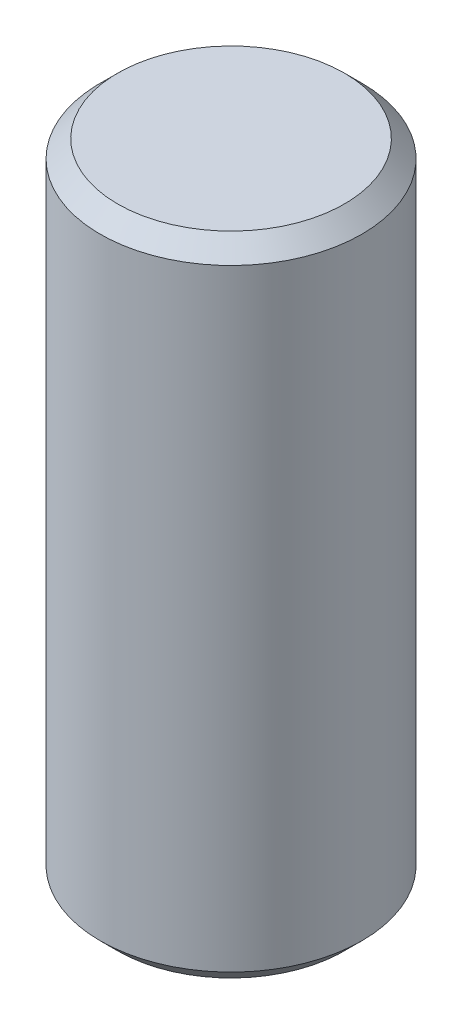
ISO-10303-21;
HEADER;
FILE_DESCRIPTION(('STEP AP214'),'2;1');
FILE_NAME('part.step','',(''),(''),'','','');
FILE_SCHEMA(('AUTOMOTIVE_DESIGN { 1 0 10303 214 1 1 1 1 }'));
ENDSEC;
DATA;
#1=APPLICATION_CONTEXT('core data for automotive mechanical design processes');
#2=APPLICATION_PROTOCOL_DEFINITION('international standard','automotive_design',2000,#1);
#3=PRODUCT_CONTEXT('',#1,'mechanical');
#4=PRODUCT('Part','Part','',(#3));
#5=PRODUCT_RELATED_PRODUCT_CATEGORY('part','',(#4));
#6=PRODUCT_DEFINITION_FORMATION('','',#4);
#7=PRODUCT_DEFINITION_CONTEXT('part definition',#1,'design');
#8=PRODUCT_DEFINITION('design','',#6,#7);
#9=PRODUCT_DEFINITION_SHAPE('','',#8);
#10=(LENGTH_UNIT() NAMED_UNIT(*) SI_UNIT(.MILLI.,.METRE.));
#11=(NAMED_UNIT(*) PLANE_ANGLE_UNIT() SI_UNIT($,.RADIAN.));
#12=(NAMED_UNIT(*) SI_UNIT($,.STERADIAN.) SOLID_ANGLE_UNIT());
#13=UNCERTAINTY_MEASURE_WITH_UNIT(LENGTH_MEASURE(1.E-05),#10,'distance_accuracy_value','');
#14=(GEOMETRIC_REPRESENTATION_CONTEXT(3) GLOBAL_UNCERTAINTY_ASSIGNED_CONTEXT((#13)) GLOBAL_UNIT_ASSIGNED_CONTEXT((#10,
#11,#12)) REPRESENTATION_CONTEXT('',''));
#15=CARTESIAN_POINT('',(0.,0.,0.));
#16=DIRECTION('',(0.,0.,1.));
#17=DIRECTION('',(1.,0.,0.));
#18=AXIS2_PLACEMENT_3D('',#15,#16,#17);
#19=CARTESIAN_POINT('',(-9.094947E-13,671.040111529768,-379.357743681072));
#20=DIRECTION('',(0.,1.,0.));
#21=DIRECTION('',(0.,0.,1.));
#22=AXIS2_PLACEMENT_3D('',#19,#20,#21);
#23=PLANE('',#22);
#24=CARTESIAN_POINT('',(-9.094947E-13,671.040111529805,-379.357743681072));
#25=DIRECTION('',(0.,-1.,0.));
#26=DIRECTION('',(0.,0.,-1.));
#27=AXIS2_PLACEMENT_3D('',#24,#25,#26);
#28=CIRCLE('',#27,1.30000000011155);
#29=CARTESIAN_POINT('',(-9.094947E-13,671.040111529805,-380.657743681184));
#30=VERTEX_POINT('',#29);
#31=EDGE_CURVE('E18',#30,#30,#28,.T.);
#32=ORIENTED_EDGE('',*,*,#31,.F.);
#33=EDGE_LOOP('',(#32));
#34=FACE_BOUND('',#33,.T.);
#35=ADVANCED_FACE('F15',(#34),#23,.T.);
#36=CARTESIAN_POINT('',(-9.094947E-13,663.623913042673,-379.357743681072));
#37=DIRECTION('',(0.,-1.,0.));
#38=DIRECTION('',(0.,0.,-1.));
#39=AXIS2_PLACEMENT_3D('',#36,#37,#38);
#40=PLANE('',#39);
#41=CARTESIAN_POINT('',(-9.094947E-13,663.623913042613,-379.357743681072));
#42=DIRECTION('',(0.,1.,0.));
#43=DIRECTION('',(0.,0.,1.));
#44=AXIS2_PLACEMENT_3D('',#41,#42,#43);
#45=CIRCLE('',#44,1.30000000011155);
#46=CARTESIAN_POINT('',(-9.094947E-13,663.623913042613,-378.05774368096));
#47=VERTEX_POINT('',#46);
#48=EDGE_CURVE('E27',#47,#47,#45,.T.);
#49=ORIENTED_EDGE('',*,*,#48,.F.);
#50=EDGE_LOOP('',(#49));
#51=FACE_BOUND('',#50,.T.);
#52=ADVANCED_FACE('F38',(#51),#40,.T.);
#53=CARTESIAN_POINT('',(-9.094947E-13,670.840111529685,-379.357743681072));
#54=DIRECTION('',(0.,-1.,0.));
#55=DIRECTION('',(0.,0.,-1.));
#56=AXIS2_PLACEMENT_3D('',#53,#54,#55);
#57=CONICAL_SURFACE('',#56,1.49999999989081,0.785398162544797);
#58=CARTESIAN_POINT('',(-9.10273654493294E-13,670.840111529768,-379.357743681072));
#59=DIRECTION('',(0.,-1.,0.));
#60=DIRECTION('',(1.,0.,0.));
#61=AXIS2_PLACEMENT_3D('',#58,#59,#60);
#62=CIRCLE('',#61,1.5);
#63=CARTESIAN_POINT('',(1.49999999999909,670.840111529768,-379.357743681072));
#64=VERTEX_POINT('',#63);
#65=EDGE_CURVE('E22',#64,#64,#62,.T.);
#66=ORIENTED_EDGE('',*,*,#65,.F.);
#67=EDGE_LOOP('',(#66));
#68=FACE_BOUND('',#67,.T.);
#69=ORIENTED_EDGE('',*,*,#31,.T.);
#70=EDGE_LOOP('',(#69));
#71=FACE_BOUND('',#70,.T.);
#72=ADVANCED_FACE('F35',(#68,#71),#57,.T.);
#73=CARTESIAN_POINT('',(-9.094947E-13,663.823913042734,-379.357743681072));
#74=DIRECTION('',(0.,1.,0.));
#75=DIRECTION('',(0.,0.,1.));
#76=AXIS2_PLACEMENT_3D('',#73,#74,#75);
#77=CONICAL_SURFACE('',#76,1.49999999989081,0.785398162544797);
#78=CARTESIAN_POINT('',(-9.08715745506706E-13,663.823913042673,-379.357743681072));
#79=DIRECTION('',(0.,-1.,0.));
#80=DIRECTION('',(1.,0.,0.));
#81=AXIS2_PLACEMENT_3D('',#78,#79,#80);
#82=CIRCLE('',#81,1.5);
#83=CARTESIAN_POINT('',(1.49999999999909,663.823913042673,-379.357743681072));
#84=VERTEX_POINT('',#83);
#85=EDGE_CURVE('E10',#84,#84,#82,.F.);
#86=ORIENTED_EDGE('',*,*,#85,.F.);
#87=EDGE_LOOP('',(#86));
#88=FACE_BOUND('',#87,.T.);
#89=ORIENTED_EDGE('',*,*,#48,.T.);
#90=EDGE_LOOP('',(#89));
#91=FACE_BOUND('',#90,.T.);
#92=ADVANCED_FACE('F46',(#88,#91),#77,.T.);
#93=CARTESIAN_POINT('',(-9.094947E-13,667.33201228622,-379.357743681072));
#94=DIRECTION('',(0.,-1.,0.));
#95=DIRECTION('',(1.,0.,0.));
#96=AXIS2_PLACEMENT_3D('',#93,#94,#95);
#97=CYLINDRICAL_SURFACE('',#96,1.5);
#98=ORIENTED_EDGE('',*,*,#65,.T.);
#99=EDGE_LOOP('',(#98));
#100=FACE_BOUND('',#99,.T.);
#101=ORIENTED_EDGE('',*,*,#85,.T.);
#102=EDGE_LOOP('',(#101));
#103=FACE_BOUND('',#102,.T.);
#104=ADVANCED_FACE('F44',(#100,#103),#97,.T.);
#105=CLOSED_SHELL('',(#35,#52,#72,#92,#104));
#106=MANIFOLD_SOLID_BREP('B1',#105);
#107=ADVANCED_BREP_SHAPE_REPRESENTATION('',(#18,#106),#14);
#108=SHAPE_DEFINITION_REPRESENTATION(#9,#107);
ENDSEC;
END-ISO-10303-21;
